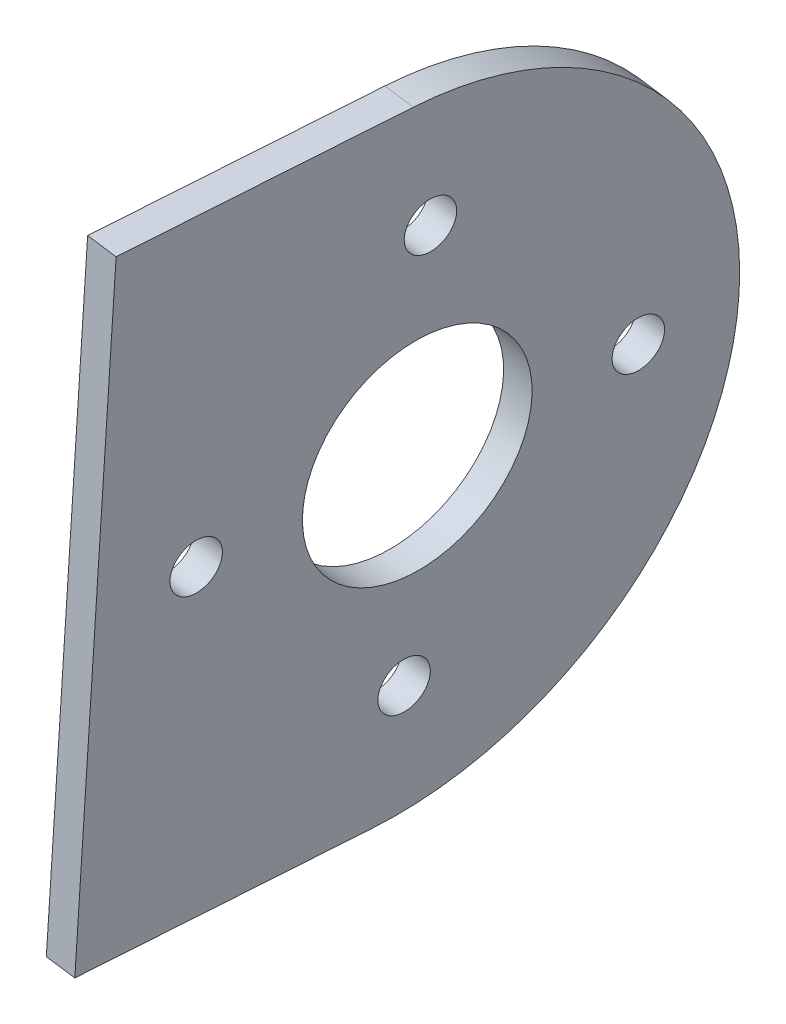
ISO-10303-21;
HEADER;
FILE_DESCRIPTION(('STEP AP214'),'2;1');
FILE_NAME('part.step','',(''),(''),'','','');
FILE_SCHEMA(('AUTOMOTIVE_DESIGN { 1 0 10303 214 1 1 1 1 }'));
ENDSEC;
DATA;
#1=APPLICATION_CONTEXT('core data for automotive mechanical design processes');
#2=APPLICATION_PROTOCOL_DEFINITION('international standard','automotive_design',2000,#1);
#3=PRODUCT_CONTEXT('',#1,'mechanical');
#4=PRODUCT('Part','Part','',(#3));
#5=PRODUCT_RELATED_PRODUCT_CATEGORY('part','',(#4));
#6=PRODUCT_DEFINITION_FORMATION('','',#4);
#7=PRODUCT_DEFINITION_CONTEXT('part definition',#1,'design');
#8=PRODUCT_DEFINITION('design','',#6,#7);
#9=PRODUCT_DEFINITION_SHAPE('','',#8);
#10=(LENGTH_UNIT() NAMED_UNIT(*) SI_UNIT(.MILLI.,.METRE.));
#11=(NAMED_UNIT(*) PLANE_ANGLE_UNIT() SI_UNIT($,.RADIAN.));
#12=(NAMED_UNIT(*) SI_UNIT($,.STERADIAN.) SOLID_ANGLE_UNIT());
#13=UNCERTAINTY_MEASURE_WITH_UNIT(LENGTH_MEASURE(1.E-05),#10,'distance_accuracy_value','');
#14=(GEOMETRIC_REPRESENTATION_CONTEXT(3) GLOBAL_UNCERTAINTY_ASSIGNED_CONTEXT((#13)) GLOBAL_UNIT_ASSIGNED_CONTEXT((#10,
#11,#12)) REPRESENTATION_CONTEXT('',''));
#15=CARTESIAN_POINT('',(0.,0.,0.));
#16=DIRECTION('',(0.,0.,1.));
#17=DIRECTION('',(1.,0.,0.));
#18=AXIS2_PLACEMENT_3D('',#15,#16,#17);
#19=CARTESIAN_POINT('',(-55.7125683105187,-1.40052215841678,-12.1317672412593));
#20=DIRECTION('',(0.995320439716843,-0.0684073116205947,0.0682470658615703));
#21=DIRECTION('',(0.,-0.706277117160107,-0.707935472890014));
#22=AXIS2_PLACEMENT_3D('',#19,#20,#21);
#23=PLANE('',#22);
#24=CARTESIAN_POINT('',(-55.7125683105187,-1.40052215841678,-12.1317672412593));
#25=DIRECTION('',(-0.995320439716843,0.0684073116205947,-0.0682470658615703));
#26=DIRECTION('',(0.0682470658615699,0.997657476149426,0.00467956028315641));
#27=AXIS2_PLACEMENT_3D('',#24,#25,#26);
#28=CIRCLE('',#27,7.);
#29=CARTESIAN_POINT('',(-56.1902977715497,-8.38412449146277,-12.1645241632414));
#30=VERTEX_POINT('',#29);
#31=EDGE_CURVE('E160',#30,#30,#28,.T.);
#32=ORIENTED_EDGE('',*,*,#31,.F.);
#33=EDGE_LOOP('',(#32));
#34=FACE_BOUND('',#33,.T.);
#35=CARTESIAN_POINT('',(-54.7890696036406,-1.40052215841679,-25.6001431692765));
#36=DIRECTION('',(0.995320439716843,-0.0684073116205947,0.0682470658615703));
#37=DIRECTION('',(-0.0682470658615699,-0.997657476149426,-0.00467956028315641));
#38=AXIS2_PLACEMENT_3D('',#35,#36,#37);
#39=CIRCLE('',#38,1.6);
#40=CARTESIAN_POINT('',(-54.6798742982621,0.195729803422289,-25.5926558728235));
#41=VERTEX_POINT('',#40);
#42=EDGE_CURVE('E128',#41,#41,#39,.T.);
#43=ORIENTED_EDGE('',*,*,#42,.T.);
#44=EDGE_LOOP('',(#43));
#45=FACE_BOUND('',#44,.T.);
#46=CARTESIAN_POINT('',(-56.6339036996499,-14.868898086434,-12.1949413050819));
#47=DIRECTION('',(0.995320439716843,-0.0684073116205947,0.0682470658615703));
#48=DIRECTION('',(-0.0682470658615699,-0.997657476149426,-0.00467956028315641));
#49=AXIS2_PLACEMENT_3D('',#46,#47,#48);
#50=CIRCLE('',#49,1.6);
#51=CARTESIAN_POINT('',(-56.5247083942714,-13.272646124595,-12.1874540086288));
#52=VERTEX_POINT('',#51);
#53=EDGE_CURVE('E133',#52,#52,#50,.T.);
#54=ORIENTED_EDGE('',*,*,#53,.T.);
#55=EDGE_LOOP('',(#54));
#56=FACE_BOUND('',#55,.T.);
#57=CARTESIAN_POINT('',(-56.6360670173967,-1.40052215841677,1.33660868675798));
#58=DIRECTION('',(0.995320439716843,-0.0684073116205947,0.0682470658615703));
#59=DIRECTION('',(-0.0682470658615699,-0.997657476149426,-0.00467956028315641));
#60=AXIS2_PLACEMENT_3D('',#57,#58,#59);
#61=CIRCLE('',#60,1.6);
#62=CARTESIAN_POINT('',(-56.5268717120182,0.195729803422311,1.34409598321104));
#63=VERTEX_POINT('',#62);
#64=EDGE_CURVE('E146',#63,#63,#61,.T.);
#65=ORIENTED_EDGE('',*,*,#64,.T.);
#66=EDGE_LOOP('',(#65));
#67=FACE_BOUND('',#66,.T.);
#68=CARTESIAN_POINT('',(-54.7912329213875,12.0678537696005,-12.0685931774367));
#69=DIRECTION('',(0.995320439716843,-0.0684073116205947,0.0682470658615703));
#70=DIRECTION('',(-0.0682470658615699,-0.997657476149426,-0.00467956028315641));
#71=AXIS2_PLACEMENT_3D('',#68,#69,#70);
#72=CIRCLE('',#71,1.6);
#73=CARTESIAN_POINT('',(-54.682037616009,13.6641057314396,-12.0611058809836));
#74=VERTEX_POINT('',#73);
#75=EDGE_CURVE('E111',#74,#74,#72,.T.);
#76=ORIENTED_EDGE('',*,*,#75,.T.);
#77=EDGE_LOOP('',(#76));
#78=FACE_BOUND('',#77,.T.);
#79=DIRECTION('',(-0.068407311620595,0.,0.997657476149426));
#80=VECTOR('',#79,1.);
#81=CARTESIAN_POINT('',(-54.3717538349774,19.6999334621436,-10.5363083270464));
#82=LINE('',#81,#80);
#83=CARTESIAN_POINT('',(-54.3717538349774,19.6999334621436,-10.5363083270464));
#84=VERTEX_POINT('',#83);
#85=CARTESIAN_POINT('',(-55.6133465408912,19.6999334621436,7.57117486506571));
#86=VERTEX_POINT('',#85);
#87=EDGE_CURVE('E25',#84,#86,#82,.T.);
#88=ORIENTED_EDGE('',*,*,#87,.F.);
#89=CARTESIAN_POINT('',(-55.8151792779496,-1.40052215841677,-10.6352810270351));
#90=DIRECTION('',(0.995320439716843,-0.0684073116205947,0.0682470658615703));
#91=DIRECTION('',(-0.0682470658615699,-0.997657476149426,-0.00467956028315662));
#92=AXIS2_PLACEMENT_3D('',#89,#90,#91);
#93=CIRCLE('',#92,21.15);
#94=CARTESIAN_POINT('',(-57.2586047209218,-22.5009777789771,-10.7342537270239));
#95=VERTEX_POINT('',#94);
#96=EDGE_CURVE('E155',#95,#84,#93,.T.);
#97=ORIENTED_EDGE('',*,*,#96,.F.);
#98=DIRECTION('',(0.0684073116205951,0.,-0.997657476149426));
#99=VECTOR('',#98,1.);
#100=CARTESIAN_POINT('',(-58.5001974268356,-22.5009777789771,7.37322946508819));
#101=LINE('',#100,#99);
#102=CARTESIAN_POINT('',(-58.5001974268356,-22.5009777789771,7.37322946508819));
#103=VERTEX_POINT('',#102);
#104=EDGE_CURVE('E188',#103,#95,#101,.T.);
#105=ORIENTED_EDGE('',*,*,#104,.F.);
#106=DIRECTION('',(-0.0682470658615699,-0.997657476149426,-0.00467956028315641));
#107=VECTOR('',#106,1.);
#108=CARTESIAN_POINT('',(-55.6133465408912,19.6999334621436,7.57117486506571));
#109=LINE('',#108,#107);
#110=EDGE_CURVE('E200',#86,#103,#109,.T.);
#111=ORIENTED_EDGE('',*,*,#110,.F.);
#112=EDGE_LOOP('',(#88,#97,#105,#111));
#113=FACE_BOUND('',#112,.T.);
#114=ADVANCED_FACE('F17',(#34,#45,#56,#67,#78,#113),#23,.F.);
#115=CARTESIAN_POINT('',(-53.721927431085,-1.53733678165797,-11.9952731095361));
#116=DIRECTION('',(0.995320439716843,-0.0684073116205947,0.0682470658615703));
#117=DIRECTION('',(0.,-0.706277117160107,-0.707935472890014));
#118=AXIS2_PLACEMENT_3D('',#115,#116,#117);
#119=PLANE('',#118);
#120=CARTESIAN_POINT('',(-53.721927431085,-1.53733678165797,-11.9952731095361));
#121=DIRECTION('',(-0.995320439716843,0.0684073116205947,-0.0682470658615703));
#122=DIRECTION('',(0.0682470658615699,0.997657476149426,0.00467956028315641));
#123=AXIS2_PLACEMENT_3D('',#120,#121,#122);
#124=CIRCLE('',#123,7.);
#125=CARTESIAN_POINT('',(-54.199656892116,-8.52093911470396,-12.0280300315182));
#126=VERTEX_POINT('',#125);
#127=EDGE_CURVE('E132',#126,#126,#124,.T.);
#128=ORIENTED_EDGE('',*,*,#127,.T.);
#129=EDGE_LOOP('',(#128));
#130=FACE_BOUND('',#129,.T.);
#131=CARTESIAN_POINT('',(-52.798428724207,-1.53733678165799,-25.4636490375534));
#132=DIRECTION('',(-0.995320439716843,0.0684073116205947,-0.0682470658615703));
#133=DIRECTION('',(-0.0682470658615699,-0.997657476149426,-0.00467956028315641));
#134=AXIS2_PLACEMENT_3D('',#131,#132,#133);
#135=CIRCLE('',#134,1.6);
#136=CARTESIAN_POINT('',(-52.6892334188285,0.058915180181097,-25.4561617411003));
#137=VERTEX_POINT('',#136);
#138=EDGE_CURVE('E127',#137,#137,#135,.T.);
#139=ORIENTED_EDGE('',*,*,#138,.T.);
#140=EDGE_LOOP('',(#139));
#141=FACE_BOUND('',#140,.T.);
#142=CARTESIAN_POINT('',(-54.6432628202162,-15.0057127096752,-12.0584471733587));
#143=DIRECTION('',(-0.995320439716843,0.0684073116205947,-0.0682470658615703));
#144=DIRECTION('',(-0.0682470658615699,-0.997657476149426,-0.00467956028315641));
#145=AXIS2_PLACEMENT_3D('',#142,#143,#144);
#146=CIRCLE('',#145,1.6);
#147=CARTESIAN_POINT('',(-54.5340675148377,-13.4094607478361,-12.0509598769057));
#148=VERTEX_POINT('',#147);
#149=EDGE_CURVE('E158',#148,#148,#146,.T.);
#150=ORIENTED_EDGE('',*,*,#149,.T.);
#151=EDGE_LOOP('',(#150));
#152=FACE_BOUND('',#151,.T.);
#153=CARTESIAN_POINT('',(-54.645426137963,-1.53733678165796,1.47310281848112));
#154=DIRECTION('',(-0.995320439716843,0.0684073116205947,-0.0682470658615703));
#155=DIRECTION('',(-0.0682470658615699,-0.997657476149426,-0.00467956028315641));
#156=AXIS2_PLACEMENT_3D('',#153,#154,#155);
#157=CIRCLE('',#156,1.6);
#158=CARTESIAN_POINT('',(-54.5362308325845,0.0589151801811192,1.48059011493418));
#159=VERTEX_POINT('',#158);
#160=EDGE_CURVE('E139',#159,#159,#157,.T.);
#161=ORIENTED_EDGE('',*,*,#160,.T.);
#162=EDGE_LOOP('',(#161));
#163=FACE_BOUND('',#162,.T.);
#164=CARTESIAN_POINT('',(-52.8005920419538,11.9310391463593,-11.9320990457135));
#165=DIRECTION('',(-0.995320439716843,0.0684073116205947,-0.0682470658615703));
#166=DIRECTION('',(-0.0682470658615699,-0.997657476149426,-0.00467956028315641));
#167=AXIS2_PLACEMENT_3D('',#164,#165,#166);
#168=CIRCLE('',#167,1.6);
#169=CARTESIAN_POINT('',(-52.6913967365753,13.5272911081984,-11.9246117492605));
#170=VERTEX_POINT('',#169);
#171=EDGE_CURVE('E114',#170,#170,#168,.T.);
#172=ORIENTED_EDGE('',*,*,#171,.T.);
#173=EDGE_LOOP('',(#172));
#174=FACE_BOUND('',#173,.T.);
#175=DIRECTION('',(-0.068407311620595,0.,0.997657476149426));
#176=VECTOR('',#175,1.);
#177=CARTESIAN_POINT('',(-52.3811129555437,19.5631188389024,-10.3998141953232));
#178=LINE('',#177,#176);
#179=CARTESIAN_POINT('',(-52.3811129555437,19.5631188389024,-10.3998141953232));
#180=VERTEX_POINT('',#179);
#181=CARTESIAN_POINT('',(-53.6227056614575,19.5631188389024,7.70766899678885));
#182=VERTEX_POINT('',#181);
#183=EDGE_CURVE('E11',#180,#182,#178,.T.);
#184=ORIENTED_EDGE('',*,*,#183,.T.);
#185=DIRECTION('',(-0.0682470658615699,-0.997657476149426,-0.00467956028315641));
#186=VECTOR('',#185,1.);
#187=CARTESIAN_POINT('',(-53.6227056614575,19.5631188389024,7.70766899678885));
#188=LINE('',#187,#186);
#189=CARTESIAN_POINT('',(-56.5095565474019,-22.6377924022183,7.50972359681133));
#190=VERTEX_POINT('',#189);
#191=EDGE_CURVE('E205',#182,#190,#188,.T.);
#192=ORIENTED_EDGE('',*,*,#191,.T.);
#193=DIRECTION('',(0.0684073116205951,0.,-0.997657476149426));
#194=VECTOR('',#193,1.);
#195=CARTESIAN_POINT('',(-56.5095565474019,-22.6377924022183,7.50972359681133));
#196=LINE('',#195,#194);
#197=CARTESIAN_POINT('',(-55.2679638414881,-22.6377924022183,-10.5977595953008));
#198=VERTEX_POINT('',#197);
#199=EDGE_CURVE('E195',#190,#198,#196,.T.);
#200=ORIENTED_EDGE('',*,*,#199,.T.);
#201=CARTESIAN_POINT('',(-53.8245383985159,-1.53733678165796,-10.498786895312));
#202=DIRECTION('',(0.995320439716843,-0.0684073116205947,0.0682470658615703));
#203=DIRECTION('',(-0.0682470658615699,-0.997657476149426,-0.00467956028315662));
#204=AXIS2_PLACEMENT_3D('',#201,#202,#203);
#205=CIRCLE('',#204,21.15);
#206=EDGE_CURVE('E181',#198,#180,#205,.T.);
#207=ORIENTED_EDGE('',*,*,#206,.T.);
#208=EDGE_LOOP('',(#184,#192,#200,#207));
#209=FACE_BOUND('',#208,.T.);
#210=ADVANCED_FACE('F119',(#130,#141,#152,#163,#174,#209),#119,.T.);
#211=CARTESIAN_POINT('',(-54.3717538349774,19.6999334621436,-10.5363083270464));
#212=DIRECTION('',(0.0682470658615699,0.997657476149426,0.00467956028315593));
#213=DIRECTION('',(0.0684073116205769,0.,-0.997657476149427));
#214=AXIS2_PLACEMENT_3D('',#211,#212,#213);
#215=PLANE('',#214);
#216=ORIENTED_EDGE('',*,*,#87,.T.);
#217=DIRECTION('',(0.995320439716843,-0.0684073116205947,0.0682470658615703));
#218=VECTOR('',#217,1.);
#219=CARTESIAN_POINT('',(-55.6133465408912,19.6999334621436,7.57117486506571));
#220=LINE('',#219,#218);
#221=EDGE_CURVE('E151',#86,#182,#220,.T.);
#222=ORIENTED_EDGE('',*,*,#221,.T.);
#223=ORIENTED_EDGE('',*,*,#183,.F.);
#224=DIRECTION('',(0.995320439716843,-0.0684073116205947,0.0682470658615703));
#225=VECTOR('',#224,1.);
#226=CARTESIAN_POINT('',(-54.3717538349774,19.6999334621436,-10.5363083270464));
#227=LINE('',#226,#225);
#228=EDGE_CURVE('E156',#84,#180,#227,.T.);
#229=ORIENTED_EDGE('',*,*,#228,.F.);
#230=EDGE_LOOP('',(#216,#222,#223,#229));
#231=FACE_BOUND('',#230,.T.);
#232=ADVANCED_FACE('F208',(#231),#215,.T.);
#233=CARTESIAN_POINT('',(-55.6133465408912,19.6999334621436,7.57117486506571));
#234=DIRECTION('',(-0.0684073116205951,0.,0.997657476149426));
#235=DIRECTION('',(0.,1.,0.));
#236=AXIS2_PLACEMENT_3D('',#233,#234,#235);
#237=PLANE('',#236);
#238=ORIENTED_EDGE('',*,*,#110,.T.);
#239=DIRECTION('',(0.995320439716843,-0.0684073116205947,0.0682470658615703));
#240=VECTOR('',#239,1.);
#241=CARTESIAN_POINT('',(-58.5001974268356,-22.5009777789771,7.37322946508819));
#242=LINE('',#241,#240);
#243=EDGE_CURVE('E194',#103,#190,#242,.T.);
#244=ORIENTED_EDGE('',*,*,#243,.T.);
#245=ORIENTED_EDGE('',*,*,#191,.F.);
#246=ORIENTED_EDGE('',*,*,#221,.F.);
#247=EDGE_LOOP('',(#238,#244,#245,#246));
#248=FACE_BOUND('',#247,.T.);
#249=ADVANCED_FACE('F211',(#248),#237,.T.);
#250=CARTESIAN_POINT('',(-58.5001974268356,-22.5009777789771,7.37322946508819));
#251=DIRECTION('',(-0.0682470658615699,-0.997657476149426,-0.0046795602831566));
#252=DIRECTION('',(-0.997668399822429,0.068247813120673,0.));
#253=AXIS2_PLACEMENT_3D('',#250,#251,#252);
#254=PLANE('',#253);
#255=ORIENTED_EDGE('',*,*,#104,.T.);
#256=DIRECTION('',(0.995320439716843,-0.0684073116205947,0.0682470658615703));
#257=VECTOR('',#256,1.);
#258=CARTESIAN_POINT('',(-57.2586047209218,-22.5009777789771,-10.7342537270239));
#259=LINE('',#258,#257);
#260=EDGE_CURVE('E184',#95,#198,#259,.T.);
#261=ORIENTED_EDGE('',*,*,#260,.T.);
#262=ORIENTED_EDGE('',*,*,#199,.F.);
#263=ORIENTED_EDGE('',*,*,#243,.F.);
#264=EDGE_LOOP('',(#255,#261,#262,#263));
#265=FACE_BOUND('',#264,.T.);
#266=ADVANCED_FACE('F220',(#265),#254,.T.);
#267=CARTESIAN_POINT('',(-55.8151792779496,-1.40052215841677,-10.6352810270351));
#268=DIRECTION('',(0.995320439716843,-0.0684073116205947,0.0682470658615703));
#269=DIRECTION('',(-0.0682470658615699,-0.997657476149426,-0.00467956028315662));
#270=AXIS2_PLACEMENT_3D('',#267,#268,#269);
#271=CYLINDRICAL_SURFACE('',#270,21.15);
#272=ORIENTED_EDGE('',*,*,#96,.T.);
#273=ORIENTED_EDGE('',*,*,#228,.T.);
#274=ORIENTED_EDGE('',*,*,#206,.F.);
#275=ORIENTED_EDGE('',*,*,#260,.F.);
#276=EDGE_LOOP('',(#272,#273,#274,#275));
#277=FACE_BOUND('',#276,.T.);
#278=ADVANCED_FACE('F222',(#277),#271,.T.);
#279=CARTESIAN_POINT('',(-55.7125683105187,-1.40052215841678,-12.1317672412593));
#280=DIRECTION('',(0.995320439716843,-0.0684073116205947,0.0682470658615703));
#281=DIRECTION('',(0.0682470658615699,0.997657476149426,0.00467956028315641));
#282=AXIS2_PLACEMENT_3D('',#279,#280,#281);
#283=CYLINDRICAL_SURFACE('',#282,7.);
#284=ORIENTED_EDGE('',*,*,#127,.F.);
#285=DIRECTION('',(-0.995320439716843,0.0684073116205947,-0.0682470658615703));
#286=VECTOR('',#285,1.);
#287=CARTESIAN_POINT('',(-56.1902977715497,-8.38412449146277,-12.1645241632414));
#288=LINE('',#287,#286);
#289=EDGE_CURVE('E167',#126,#30,#288,.T.);
#290=ORIENTED_EDGE('',*,*,#289,.T.);
#291=ORIENTED_EDGE('',*,*,#31,.T.);
#292=ORIENTED_EDGE('',*,*,#289,.F.);
#293=EDGE_LOOP('',(#284,#290,#291,#292));
#294=FACE_BOUND('',#293,.T.);
#295=ADVANCED_FACE('F256',(#294),#283,.F.);
#296=CARTESIAN_POINT('',(-55.2867298234991,-1.3663185026065,-25.6342667022073));
#297=DIRECTION('',(0.995320439716843,-0.0684073116205947,0.0682470658615703));
#298=DIRECTION('',(-0.0682470658615699,-0.997657476149426,-0.00467956028315641));
#299=AXIS2_PLACEMENT_3D('',#296,#297,#298);
#300=CYLINDRICAL_SURFACE('',#299,1.6);
#301=ORIENTED_EDGE('',*,*,#138,.F.);
#302=DIRECTION('',(-0.995320439716843,0.0684073116205947,-0.0682470658615703));
#303=VECTOR('',#302,1.);
#304=CARTESIAN_POINT('',(-55.1775345181206,0.229933459232584,-25.6267794057543));
#305=LINE('',#304,#303);
#306=EDGE_CURVE('E124',#137,#41,#305,.T.);
#307=ORIENTED_EDGE('',*,*,#306,.T.);
#308=ORIENTED_EDGE('',*,*,#42,.F.);
#309=ORIENTED_EDGE('',*,*,#306,.F.);
#310=EDGE_LOOP('',(#301,#307,#308,#309));
#311=FACE_BOUND('',#310,.T.);
#312=ADVANCED_FACE('F252',(#311),#300,.F.);
#313=CARTESIAN_POINT('',(-57.1315639195083,-14.8346944306237,-12.2290648380127));
#314=DIRECTION('',(0.995320439716843,-0.0684073116205947,0.0682470658615703));
#315=DIRECTION('',(-0.0682470658615699,-0.997657476149426,-0.00467956028315641));
#316=AXIS2_PLACEMENT_3D('',#313,#314,#315);
#317=CYLINDRICAL_SURFACE('',#316,1.6);
#318=ORIENTED_EDGE('',*,*,#149,.F.);
#319=DIRECTION('',(-0.995320439716843,0.0684073116205947,-0.0682470658615703));
#320=VECTOR('',#319,1.);
#321=CARTESIAN_POINT('',(-57.0223686141298,-13.2384424687847,-12.2215775415596));
#322=LINE('',#321,#320);
#323=EDGE_CURVE('E140',#148,#52,#322,.T.);
#324=ORIENTED_EDGE('',*,*,#323,.T.);
#325=ORIENTED_EDGE('',*,*,#53,.F.);
#326=ORIENTED_EDGE('',*,*,#323,.F.);
#327=EDGE_LOOP('',(#318,#324,#325,#326));
#328=FACE_BOUND('',#327,.T.);
#329=ADVANCED_FACE('F243',(#328),#317,.F.);
#330=CARTESIAN_POINT('',(-57.1337272372551,-1.36631850260648,1.3024851538272));
#331=DIRECTION('',(0.995320439716843,-0.0684073116205947,0.0682470658615703));
#332=DIRECTION('',(-0.0682470658615699,-0.997657476149426,-0.00467956028315641));
#333=AXIS2_PLACEMENT_3D('',#330,#331,#332);
#334=CYLINDRICAL_SURFACE('',#333,1.6);
#335=ORIENTED_EDGE('',*,*,#160,.F.);
#336=DIRECTION('',(-0.995320439716843,0.0684073116205947,-0.0682470658615703));
#337=VECTOR('',#336,1.);
#338=CARTESIAN_POINT('',(-57.0245319318766,0.229933459232606,1.30997245028025));
#339=LINE('',#338,#337);
#340=EDGE_CURVE('E145',#159,#63,#339,.T.);
#341=ORIENTED_EDGE('',*,*,#340,.T.);
#342=ORIENTED_EDGE('',*,*,#64,.F.);
#343=ORIENTED_EDGE('',*,*,#340,.F.);
#344=EDGE_LOOP('',(#335,#341,#342,#343));
#345=FACE_BOUND('',#344,.T.);
#346=ADVANCED_FACE('F241',(#345),#334,.F.);
#347=CARTESIAN_POINT('',(-55.2888931412459,12.1020574254108,-12.1027167103674));
#348=DIRECTION('',(0.995320439716843,-0.0684073116205947,0.0682470658615703));
#349=DIRECTION('',(-0.0682470658615699,-0.997657476149426,-0.00467956028315641));
#350=AXIS2_PLACEMENT_3D('',#347,#348,#349);
#351=CYLINDRICAL_SURFACE('',#350,1.6);
#352=ORIENTED_EDGE('',*,*,#171,.F.);
#353=DIRECTION('',(-0.995320439716843,0.0684073116205947,-0.0682470658615703));
#354=VECTOR('',#353,1.);
#355=CARTESIAN_POINT('',(-55.1796978358674,13.6983093872499,-12.0952294139144));
#356=LINE('',#355,#354);
#357=EDGE_CURVE('E109',#170,#74,#356,.T.);
#358=ORIENTED_EDGE('',*,*,#357,.T.);
#359=ORIENTED_EDGE('',*,*,#75,.F.);
#360=ORIENTED_EDGE('',*,*,#357,.F.);
#361=EDGE_LOOP('',(#352,#358,#359,#360));
#362=FACE_BOUND('',#361,.T.);
#363=ADVANCED_FACE('F115',(#362),#351,.F.);
#364=CLOSED_SHELL('',(#114,#210,#232,#249,#266,#278,#295,#312,#329,#346,#363));
#365=MANIFOLD_SOLID_BREP('B1',#364);
#366=ADVANCED_BREP_SHAPE_REPRESENTATION('',(#18,#365),#14);
#367=SHAPE_DEFINITION_REPRESENTATION(#9,#366);
ENDSEC;
END-ISO-10303-21;
